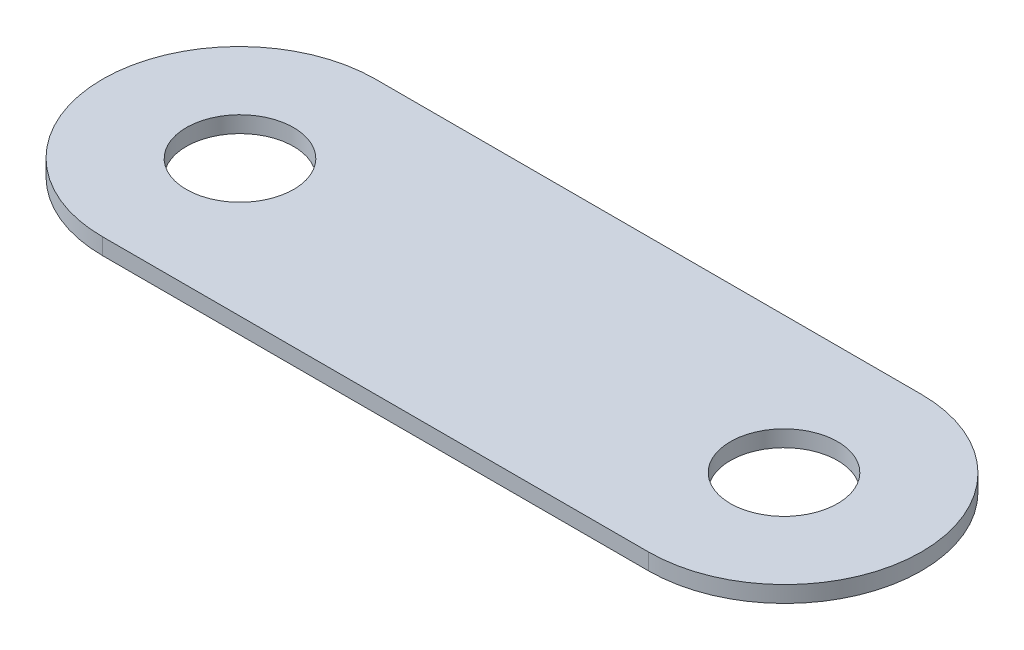
ISO-10303-21;
HEADER;
FILE_DESCRIPTION(('STEP AP214'),'2;1');
FILE_NAME('part.step','',(''),(''),'','','');
FILE_SCHEMA(('AUTOMOTIVE_DESIGN { 1 0 10303 214 1 1 1 1 }'));
ENDSEC;
DATA;
#1=APPLICATION_CONTEXT('core data for automotive mechanical design processes');
#2=APPLICATION_PROTOCOL_DEFINITION('international standard','automotive_design',2000,#1);
#3=PRODUCT_CONTEXT('',#1,'mechanical');
#4=PRODUCT('Part','Part','',(#3));
#5=PRODUCT_RELATED_PRODUCT_CATEGORY('part','',(#4));
#6=PRODUCT_DEFINITION_FORMATION('','',#4);
#7=PRODUCT_DEFINITION_CONTEXT('part definition',#1,'design');
#8=PRODUCT_DEFINITION('design','',#6,#7);
#9=PRODUCT_DEFINITION_SHAPE('','',#8);
#10=(LENGTH_UNIT() NAMED_UNIT(*) SI_UNIT(.MILLI.,.METRE.));
#11=(NAMED_UNIT(*) PLANE_ANGLE_UNIT() SI_UNIT($,.RADIAN.));
#12=(NAMED_UNIT(*) SI_UNIT($,.STERADIAN.) SOLID_ANGLE_UNIT());
#13=UNCERTAINTY_MEASURE_WITH_UNIT(LENGTH_MEASURE(1.E-05),#10,'distance_accuracy_value','');
#14=(GEOMETRIC_REPRESENTATION_CONTEXT(3) GLOBAL_UNCERTAINTY_ASSIGNED_CONTEXT((#13)) GLOBAL_UNIT_ASSIGNED_CONTEXT((#10,
#11,#12)) REPRESENTATION_CONTEXT('',''));
#15=CARTESIAN_POINT('',(0.,0.,0.));
#16=DIRECTION('',(0.,0.,1.));
#17=DIRECTION('',(1.,0.,0.));
#18=AXIS2_PLACEMENT_3D('',#15,#16,#17);
#19=CARTESIAN_POINT('',(-20.,1.2,0.));
#20=DIRECTION('',(0.,-1.,0.));
#21=DIRECTION('',(0.,0.,-1.));
#22=AXIS2_PLACEMENT_3D('',#19,#20,#21);
#23=CYLINDRICAL_SURFACE('',#22,10.);
#24=CARTESIAN_POINT('',(-20.,0.,0.));
#25=DIRECTION('',(0.,1.,0.));
#26=DIRECTION('',(0.,0.,1.));
#27=AXIS2_PLACEMENT_3D('',#24,#25,#26);
#28=CIRCLE('',#27,10.);
#29=CARTESIAN_POINT('',(-20.,0.,-10.));
#30=VERTEX_POINT('',#29);
#31=CARTESIAN_POINT('',(-20.,0.,10.));
#32=VERTEX_POINT('',#31);
#33=EDGE_CURVE('E95',#30,#32,#28,.T.);
#34=ORIENTED_EDGE('',*,*,#33,.T.);
#35=DIRECTION('',(0.,-1.,0.));
#36=VECTOR('',#35,1.);
#37=CARTESIAN_POINT('',(-20.,1.2,10.));
#38=LINE('',#37,#36);
#39=CARTESIAN_POINT('',(-20.,1.2,10.));
#40=VERTEX_POINT('',#39);
#41=EDGE_CURVE('E11',#40,#32,#38,.T.);
#42=ORIENTED_EDGE('',*,*,#41,.F.);
#43=CARTESIAN_POINT('',(-20.,1.2,0.));
#44=DIRECTION('',(0.,1.,0.));
#45=DIRECTION('',(0.,0.,1.));
#46=AXIS2_PLACEMENT_3D('',#43,#44,#45);
#47=CIRCLE('',#46,10.);
#48=CARTESIAN_POINT('',(-20.,1.2,-10.));
#49=VERTEX_POINT('',#48);
#50=EDGE_CURVE('E83',#49,#40,#47,.T.);
#51=ORIENTED_EDGE('',*,*,#50,.F.);
#52=DIRECTION('',(0.,-1.,0.));
#53=VECTOR('',#52,1.);
#54=CARTESIAN_POINT('',(-20.,1.2,-10.));
#55=LINE('',#54,#53);
#56=EDGE_CURVE('E91',#49,#30,#55,.T.);
#57=ORIENTED_EDGE('',*,*,#56,.T.);
#58=EDGE_LOOP('',(#34,#42,#51,#57));
#59=FACE_BOUND('',#58,.T.);
#60=ADVANCED_FACE('F32',(#59),#23,.T.);
#61=CARTESIAN_POINT('',(-20.,1.2,10.));
#62=DIRECTION('',(0.,0.,-1.));
#63=DIRECTION('',(-1.,0.,0.));
#64=AXIS2_PLACEMENT_3D('',#61,#62,#63);
#65=PLANE('',#64);
#66=DIRECTION('',(1.,0.,0.));
#67=VECTOR('',#66,1.);
#68=CARTESIAN_POINT('',(-20.,0.,10.));
#69=LINE('',#68,#67);
#70=CARTESIAN_POINT('',(20.,0.,9.99999999999999));
#71=VERTEX_POINT('',#70);
#72=EDGE_CURVE('E87',#32,#71,#69,.T.);
#73=ORIENTED_EDGE('',*,*,#72,.T.);
#74=DIRECTION('',(0.,-1.,0.));
#75=VECTOR('',#74,1.);
#76=CARTESIAN_POINT('',(20.,1.2,9.99999999999999));
#77=LINE('',#76,#75);
#78=CARTESIAN_POINT('',(20.,1.2,9.99999999999999));
#79=VERTEX_POINT('',#78);
#80=EDGE_CURVE('E40',#79,#71,#77,.T.);
#81=ORIENTED_EDGE('',*,*,#80,.F.);
#82=DIRECTION('',(1.,0.,0.));
#83=VECTOR('',#82,1.);
#84=CARTESIAN_POINT('',(-20.,1.2,10.));
#85=LINE('',#84,#83);
#86=EDGE_CURVE('E78',#40,#79,#85,.T.);
#87=ORIENTED_EDGE('',*,*,#86,.F.);
#88=ORIENTED_EDGE('',*,*,#41,.T.);
#89=EDGE_LOOP('',(#73,#81,#87,#88));
#90=FACE_BOUND('',#89,.T.);
#91=ADVANCED_FACE('F86',(#90),#65,.F.);
#92=CARTESIAN_POINT('',(20.,1.2,0.));
#93=DIRECTION('',(0.,-1.,0.));
#94=DIRECTION('',(0.,0.,-1.));
#95=AXIS2_PLACEMENT_3D('',#92,#93,#94);
#96=CYLINDRICAL_SURFACE('',#95,10.);
#97=CARTESIAN_POINT('',(20.,0.,0.));
#98=DIRECTION('',(0.,1.,0.));
#99=DIRECTION('',(0.,0.,1.));
#100=AXIS2_PLACEMENT_3D('',#97,#98,#99);
#101=CIRCLE('',#100,10.);
#102=CARTESIAN_POINT('',(20.,0.,-10.));
#103=VERTEX_POINT('',#102);
#104=EDGE_CURVE('E65',#71,#103,#101,.T.);
#105=ORIENTED_EDGE('',*,*,#104,.T.);
#106=DIRECTION('',(0.,-1.,0.));
#107=VECTOR('',#106,1.);
#108=CARTESIAN_POINT('',(20.,1.2,-10.));
#109=LINE('',#108,#107);
#110=CARTESIAN_POINT('',(20.,1.2,-10.));
#111=VERTEX_POINT('',#110);
#112=EDGE_CURVE('E88',#111,#103,#109,.T.);
#113=ORIENTED_EDGE('',*,*,#112,.F.);
#114=CARTESIAN_POINT('',(20.,1.2,0.));
#115=DIRECTION('',(0.,1.,0.));
#116=DIRECTION('',(0.,0.,1.));
#117=AXIS2_PLACEMENT_3D('',#114,#115,#116);
#118=CIRCLE('',#117,10.);
#119=EDGE_CURVE('E81',#79,#111,#118,.T.);
#120=ORIENTED_EDGE('',*,*,#119,.F.);
#121=ORIENTED_EDGE('',*,*,#80,.T.);
#122=EDGE_LOOP('',(#105,#113,#120,#121));
#123=FACE_BOUND('',#122,.T.);
#124=ADVANCED_FACE('F89',(#123),#96,.T.);
#125=CARTESIAN_POINT('',(-20.,1.2,-10.));
#126=DIRECTION('',(0.,0.,1.));
#127=DIRECTION('',(1.,0.,0.));
#128=AXIS2_PLACEMENT_3D('',#125,#126,#127);
#129=PLANE('',#128);
#130=DIRECTION('',(-1.,0.,0.));
#131=VECTOR('',#130,1.);
#132=CARTESIAN_POINT('',(-20.,0.,-10.));
#133=LINE('',#132,#131);
#134=EDGE_CURVE('E71',#103,#30,#133,.T.);
#135=ORIENTED_EDGE('',*,*,#134,.T.);
#136=ORIENTED_EDGE('',*,*,#56,.F.);
#137=DIRECTION('',(-1.,0.,0.));
#138=VECTOR('',#137,1.);
#139=CARTESIAN_POINT('',(-20.,1.2,-10.));
#140=LINE('',#139,#138);
#141=EDGE_CURVE('E48',#111,#49,#140,.T.);
#142=ORIENTED_EDGE('',*,*,#141,.F.);
#143=ORIENTED_EDGE('',*,*,#112,.T.);
#144=EDGE_LOOP('',(#135,#136,#142,#143));
#145=FACE_BOUND('',#144,.T.);
#146=ADVANCED_FACE('F103',(#145),#129,.F.);
#147=CARTESIAN_POINT('',(-20.,1.2,0.));
#148=DIRECTION('',(0.,1.,0.));
#149=DIRECTION('',(0.,0.,1.));
#150=AXIS2_PLACEMENT_3D('',#147,#148,#149);
#151=PLANE('',#150);
#152=CARTESIAN_POINT('',(19.93,1.2,0.));
#153=DIRECTION('',(0.,1.,0.));
#154=DIRECTION('',(0.,0.,1.));
#155=AXIS2_PLACEMENT_3D('',#152,#153,#154);
#156=CIRCLE('',#155,3.93);
#157=CARTESIAN_POINT('',(19.93,1.2,3.93));
#158=VERTEX_POINT('',#157);
#159=EDGE_CURVE('E115',#158,#158,#156,.T.);
#160=ORIENTED_EDGE('',*,*,#159,.F.);
#161=EDGE_LOOP('',(#160));
#162=FACE_BOUND('',#161,.T.);
#163=CARTESIAN_POINT('',(-19.93,1.2,0.));
#164=DIRECTION('',(0.,1.,0.));
#165=DIRECTION('',(0.,0.,1.));
#166=AXIS2_PLACEMENT_3D('',#163,#164,#165);
#167=CIRCLE('',#166,3.93);
#168=CARTESIAN_POINT('',(-19.93,1.2,3.93));
#169=VERTEX_POINT('',#168);
#170=EDGE_CURVE('E109',#169,#169,#167,.T.);
#171=ORIENTED_EDGE('',*,*,#170,.F.);
#172=EDGE_LOOP('',(#171));
#173=FACE_BOUND('',#172,.T.);
#174=ORIENTED_EDGE('',*,*,#50,.T.);
#175=ORIENTED_EDGE('',*,*,#86,.T.);
#176=ORIENTED_EDGE('',*,*,#119,.T.);
#177=ORIENTED_EDGE('',*,*,#141,.T.);
#178=EDGE_LOOP('',(#174,#175,#176,#177));
#179=FACE_BOUND('',#178,.T.);
#180=ADVANCED_FACE('F79',(#162,#173,#179),#151,.T.);
#181=CARTESIAN_POINT('',(-20.,0.,0.));
#182=DIRECTION('',(0.,1.,0.));
#183=DIRECTION('',(0.,0.,1.));
#184=AXIS2_PLACEMENT_3D('',#181,#182,#183);
#185=PLANE('',#184);
#186=CARTESIAN_POINT('',(19.93,0.,0.));
#187=DIRECTION('',(0.,1.,0.));
#188=DIRECTION('',(0.,0.,1.));
#189=AXIS2_PLACEMENT_3D('',#186,#187,#188);
#190=CIRCLE('',#189,3.93);
#191=CARTESIAN_POINT('',(19.93,0.,3.93));
#192=VERTEX_POINT('',#191);
#193=EDGE_CURVE('E112',#192,#192,#190,.T.);
#194=ORIENTED_EDGE('',*,*,#193,.T.);
#195=EDGE_LOOP('',(#194));
#196=FACE_BOUND('',#195,.T.);
#197=CARTESIAN_POINT('',(-19.93,0.,0.));
#198=DIRECTION('',(0.,1.,0.));
#199=DIRECTION('',(0.,0.,1.));
#200=AXIS2_PLACEMENT_3D('',#197,#198,#199);
#201=CIRCLE('',#200,3.93);
#202=CARTESIAN_POINT('',(-19.93,0.,3.93));
#203=VERTEX_POINT('',#202);
#204=EDGE_CURVE('E98',#203,#203,#201,.T.);
#205=ORIENTED_EDGE('',*,*,#204,.T.);
#206=EDGE_LOOP('',(#205));
#207=FACE_BOUND('',#206,.T.);
#208=ORIENTED_EDGE('',*,*,#33,.F.);
#209=ORIENTED_EDGE('',*,*,#134,.F.);
#210=ORIENTED_EDGE('',*,*,#104,.F.);
#211=ORIENTED_EDGE('',*,*,#72,.F.);
#212=EDGE_LOOP('',(#208,#209,#210,#211));
#213=FACE_BOUND('',#212,.T.);
#214=ADVANCED_FACE('F106',(#196,#207,#213),#185,.F.);
#215=CARTESIAN_POINT('',(-19.93,0.,0.));
#216=DIRECTION('',(0.,1.,0.));
#217=DIRECTION('',(0.,0.,1.));
#218=AXIS2_PLACEMENT_3D('',#215,#216,#217);
#219=CYLINDRICAL_SURFACE('',#218,3.93);
#220=ORIENTED_EDGE('',*,*,#204,.F.);
#221=EDGE_LOOP('',(#220));
#222=FACE_BOUND('',#221,.T.);
#223=ORIENTED_EDGE('',*,*,#170,.T.);
#224=EDGE_LOOP('',(#223));
#225=FACE_BOUND('',#224,.T.);
#226=ADVANCED_FACE('F126',(#222,#225),#219,.F.);
#227=CARTESIAN_POINT('',(19.93,0.,0.));
#228=DIRECTION('',(0.,1.,0.));
#229=DIRECTION('',(0.,0.,1.));
#230=AXIS2_PLACEMENT_3D('',#227,#228,#229);
#231=CYLINDRICAL_SURFACE('',#230,3.93);
#232=ORIENTED_EDGE('',*,*,#193,.F.);
#233=EDGE_LOOP('',(#232));
#234=FACE_BOUND('',#233,.T.);
#235=ORIENTED_EDGE('',*,*,#159,.T.);
#236=EDGE_LOOP('',(#235));
#237=FACE_BOUND('',#236,.T.);
#238=ADVANCED_FACE('F123',(#234,#237),#231,.F.);
#239=CLOSED_SHELL('',(#60,#91,#124,#146,#180,#214,#226,#238));
#240=MANIFOLD_SOLID_BREP('B2',#239);
#241=ADVANCED_BREP_SHAPE_REPRESENTATION('',(#18,#240),#14);
#242=SHAPE_DEFINITION_REPRESENTATION(#9,#241);
ENDSEC;
END-ISO-10303-21;
